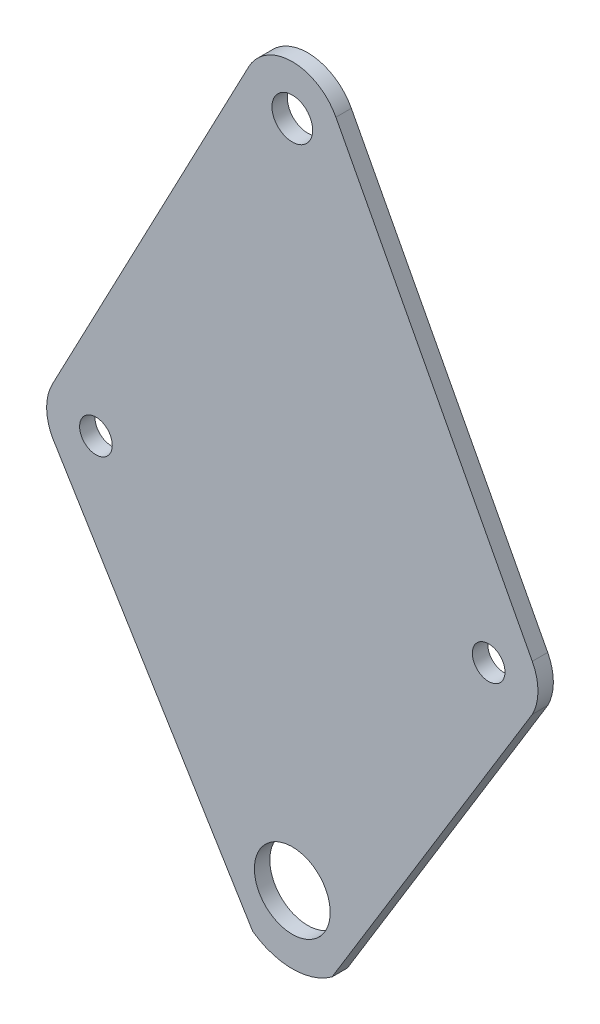
ISO-10303-21;
HEADER;
FILE_DESCRIPTION(('STEP AP214'),'2;1');
FILE_NAME('part.step','',(''),(''),'','','');
FILE_SCHEMA(('AUTOMOTIVE_DESIGN { 1 0 10303 214 1 1 1 1 }'));
ENDSEC;
DATA;
#1=APPLICATION_CONTEXT('core data for automotive mechanical design processes');
#2=APPLICATION_PROTOCOL_DEFINITION('international standard','automotive_design',2000,#1);
#3=PRODUCT_CONTEXT('',#1,'mechanical');
#4=PRODUCT('Part','Part','',(#3));
#5=PRODUCT_RELATED_PRODUCT_CATEGORY('part','',(#4));
#6=PRODUCT_DEFINITION_FORMATION('','',#4);
#7=PRODUCT_DEFINITION_CONTEXT('part definition',#1,'design');
#8=PRODUCT_DEFINITION('design','',#6,#7);
#9=PRODUCT_DEFINITION_SHAPE('','',#8);
#10=(LENGTH_UNIT() NAMED_UNIT(*) SI_UNIT(.MILLI.,.METRE.));
#11=(NAMED_UNIT(*) PLANE_ANGLE_UNIT() SI_UNIT($,.RADIAN.));
#12=(NAMED_UNIT(*) SI_UNIT($,.STERADIAN.) SOLID_ANGLE_UNIT());
#13=UNCERTAINTY_MEASURE_WITH_UNIT(LENGTH_MEASURE(1.E-05),#10,'distance_accuracy_value','');
#14=(GEOMETRIC_REPRESENTATION_CONTEXT(3) GLOBAL_UNCERTAINTY_ASSIGNED_CONTEXT((#13)) GLOBAL_UNIT_ASSIGNED_CONTEXT((#10,
#11,#12)) REPRESENTATION_CONTEXT('',''));
#15=CARTESIAN_POINT('',(0.,0.,0.));
#16=DIRECTION('',(0.,0.,1.));
#17=DIRECTION('',(1.,0.,0.));
#18=AXIS2_PLACEMENT_3D('',#15,#16,#17);
#19=CARTESIAN_POINT('',(10.9931399475967,-6.72221027351854,3.175));
#20=DIRECTION('',(-0.853137453063207,0.521686195121957,0.));
#21=DIRECTION('',(-0.521686195121957,-0.853137453063207,0.));
#22=AXIS2_PLACEMENT_3D('',#19,#20,#21);
#23=PLANE('',#22);
#24=DIRECTION('',(0.521686195121957,0.853137453063207,0.));
#25=VECTOR('',#24,1.);
#26=CARTESIAN_POINT('',(10.9931399475967,-6.72221027351854,0.));
#27=LINE('',#26,#25);
#28=CARTESIAN_POINT('',(8.17779026727476,-11.3262812230876,0.));
#29=VERTEX_POINT('',#28);
#30=CARTESIAN_POINT('',(49.4532460993312,56.1733720011107,0.));
#31=VERTEX_POINT('',#30);
#32=EDGE_CURVE('E162',#29,#31,#27,.T.);
#33=ORIENTED_EDGE('',*,*,#32,.T.);
#34=DIRECTION('',(0.,0.,-1.));
#35=VECTOR('',#34,1.);
#36=CARTESIAN_POINT('',(49.4532460993312,56.1733720011107,3.175));
#37=LINE('',#36,#35);
#38=CARTESIAN_POINT('',(49.4532460993312,56.1733720011107,3.175));
#39=VERTEX_POINT('',#38);
#40=EDGE_CURVE('E11',#39,#31,#37,.T.);
#41=ORIENTED_EDGE('',*,*,#40,.F.);
#42=DIRECTION('',(0.521686195121957,0.853137453063207,0.));
#43=VECTOR('',#42,1.);
#44=CARTESIAN_POINT('',(10.9931399475967,-6.72221027351854,3.175));
#45=LINE('',#44,#43);
#46=CARTESIAN_POINT('',(8.17779026727476,-11.3262812230876,3.175));
#47=VERTEX_POINT('',#46);
#48=EDGE_CURVE('E204',#47,#39,#45,.T.);
#49=ORIENTED_EDGE('',*,*,#48,.F.);
#50=DIRECTION('',(0.,0.,-1.));
#51=VECTOR('',#50,1.);
#52=CARTESIAN_POINT('',(8.17779026727476,-11.3262812230876,3.175));
#53=LINE('',#52,#51);
#54=EDGE_CURVE('E161',#47,#29,#53,.T.);
#55=ORIENTED_EDGE('',*,*,#54,.T.);
#56=EDGE_LOOP('',(#33,#41,#49,#55));
#57=FACE_BOUND('',#56,.T.);
#58=ADVANCED_FACE('F45',(#57),#23,.F.);
#59=CARTESIAN_POINT('',(40.4627403985417,60.9058562582501,3.175));
#60=DIRECTION('',(0.,0.,-1.));
#61=DIRECTION('',(-1.,0.,0.));
#62=AXIS2_PLACEMENT_3D('',#59,#60,#61);
#63=CYLINDRICAL_SURFACE('',#62,10.16);
#64=CARTESIAN_POINT('',(40.4627403985417,60.9058562582501,0.));
#65=DIRECTION('',(0.,0.,1.));
#66=DIRECTION('',(1.,0.,0.));
#67=AXIS2_PLACEMENT_3D('',#64,#65,#66);
#68=CIRCLE('',#67,10.16);
#69=CARTESIAN_POINT('',(49.4532460993312,65.6383405153894,0.));
#70=VERTEX_POINT('',#69);
#71=EDGE_CURVE('E166',#31,#70,#68,.T.);
#72=ORIENTED_EDGE('',*,*,#71,.T.);
#73=DIRECTION('',(0.,0.,-1.));
#74=VECTOR('',#73,1.);
#75=CARTESIAN_POINT('',(49.4532460993312,65.6383405153894,3.175));
#76=LINE('',#75,#74);
#77=CARTESIAN_POINT('',(49.4532460993312,65.6383405153894,3.175));
#78=VERTEX_POINT('',#77);
#79=EDGE_CURVE('E54',#78,#70,#76,.T.);
#80=ORIENTED_EDGE('',*,*,#79,.F.);
#81=CARTESIAN_POINT('',(40.4627403985417,60.9058562582501,3.175));
#82=DIRECTION('',(0.,0.,1.));
#83=DIRECTION('',(1.,0.,0.));
#84=AXIS2_PLACEMENT_3D('',#81,#82,#83);
#85=CIRCLE('',#84,10.16);
#86=EDGE_CURVE('E101',#39,#78,#85,.T.);
#87=ORIENTED_EDGE('',*,*,#86,.F.);
#88=ORIENTED_EDGE('',*,*,#40,.T.);
#89=EDGE_LOOP('',(#72,#80,#87,#88));
#90=FACE_BOUND('',#89,.T.);
#91=ADVANCED_FACE('F246',(#90),#63,.T.);
#92=CARTESIAN_POINT('',(65.7783383451268,34.6248543785212,3.175));
#93=DIRECTION('',(-0.88489229338479,-0.465795694600333,0.));
#94=DIRECTION('',(0.465795694600333,-0.88489229338479,0.));
#95=AXIS2_PLACEMENT_3D('',#92,#93,#94);
#96=PLANE('',#95);
#97=DIRECTION('',(-0.465795694600333,0.88489229338479,0.));
#98=VECTOR('',#97,1.);
#99=CARTESIAN_POINT('',(65.7783383451268,34.6248543785212,0.));
#100=LINE('',#99,#98);
#101=CARTESIAN_POINT('',(8.99050570078949,142.507164257139,0.));
#102=VERTEX_POINT('',#101);
#103=EDGE_CURVE('E169',#70,#102,#100,.T.);
#104=ORIENTED_EDGE('',*,*,#103,.T.);
#105=DIRECTION('',(0.,0.,-1.));
#106=VECTOR('',#105,1.);
#107=CARTESIAN_POINT('',(8.99050570078949,142.507164257139,3.175));
#108=LINE('',#107,#106);
#109=CARTESIAN_POINT('',(8.99050570078949,142.507164257139,3.175));
#110=VERTEX_POINT('',#109);
#111=EDGE_CURVE('E214',#110,#102,#108,.T.);
#112=ORIENTED_EDGE('',*,*,#111,.F.);
#113=DIRECTION('',(-0.465795694600333,0.88489229338479,0.));
#114=VECTOR('',#113,1.);
#115=CARTESIAN_POINT('',(65.7783383451268,34.6248543785212,3.175));
#116=LINE('',#115,#114);
#117=EDGE_CURVE('E223',#78,#110,#116,.T.);
#118=ORIENTED_EDGE('',*,*,#117,.F.);
#119=ORIENTED_EDGE('',*,*,#79,.T.);
#120=EDGE_LOOP('',(#104,#112,#118,#119));
#121=FACE_BOUND('',#120,.T.);
#122=ADVANCED_FACE('F221',(#121),#96,.F.);
#123=CARTESIAN_POINT('',(0.,137.77468,3.175));
#124=DIRECTION('',(0.,0.,-1.));
#125=DIRECTION('',(-1.,0.,0.));
#126=AXIS2_PLACEMENT_3D('',#123,#124,#125);
#127=CYLINDRICAL_SURFACE('',#126,10.16);
#128=CARTESIAN_POINT('',(0.,137.77468,0.));
#129=DIRECTION('',(0.,0.,1.));
#130=DIRECTION('',(1.,0.,0.));
#131=AXIS2_PLACEMENT_3D('',#128,#129,#130);
#132=CIRCLE('',#131,10.16);
#133=CARTESIAN_POINT('',(-8.99050570078951,142.507164257139,0.));
#134=VERTEX_POINT('',#133);
#135=EDGE_CURVE('E173',#134,#102,#132,.F.);
#136=ORIENTED_EDGE('',*,*,#135,.F.);
#137=DIRECTION('',(0.,0.,-1.));
#138=VECTOR('',#137,1.);
#139=CARTESIAN_POINT('',(-8.99050570078951,142.507164257139,3.175));
#140=LINE('',#139,#138);
#141=CARTESIAN_POINT('',(-8.99050570078951,142.507164257139,3.175));
#142=VERTEX_POINT('',#141);
#143=EDGE_CURVE('E211',#142,#134,#140,.T.);
#144=ORIENTED_EDGE('',*,*,#143,.F.);
#145=CARTESIAN_POINT('',(0.,137.77468,3.175));
#146=DIRECTION('',(0.,0.,1.));
#147=DIRECTION('',(1.,0.,0.));
#148=AXIS2_PLACEMENT_3D('',#145,#146,#147);
#149=CIRCLE('',#148,10.16);
#150=EDGE_CURVE('E233',#142,#110,#149,.F.);
#151=ORIENTED_EDGE('',*,*,#150,.T.);
#152=ORIENTED_EDGE('',*,*,#111,.T.);
#153=EDGE_LOOP('',(#136,#144,#151,#152));
#154=FACE_BOUND('',#153,.T.);
#155=ADVANCED_FACE('F231',(#154),#127,.T.);
#156=CARTESIAN_POINT('',(-65.7783383451263,34.6248543785204,3.175));
#157=DIRECTION('',(-0.884892293384793,0.465795694600327,0.));
#158=DIRECTION('',(-0.465795694600327,-0.884892293384793,0.));
#159=AXIS2_PLACEMENT_3D('',#156,#157,#158);
#160=PLANE('',#159);
#161=DIRECTION('',(0.465795694600327,0.884892293384793,0.));
#162=VECTOR('',#161,1.);
#163=CARTESIAN_POINT('',(-65.7783383451263,34.6248543785204,0.));
#164=LINE('',#163,#162);
#165=CARTESIAN_POINT('',(-49.4532460993307,65.6383405153891,0.));
#166=VERTEX_POINT('',#165);
#167=EDGE_CURVE('E177',#166,#134,#164,.T.);
#168=ORIENTED_EDGE('',*,*,#167,.F.);
#169=DIRECTION('',(0.,0.,-1.));
#170=VECTOR('',#169,1.);
#171=CARTESIAN_POINT('',(-49.4532460993307,65.6383405153891,3.175));
#172=LINE('',#171,#170);
#173=CARTESIAN_POINT('',(-49.4532460993307,65.6383405153891,3.175));
#174=VERTEX_POINT('',#173);
#175=EDGE_CURVE('E127',#174,#166,#172,.T.);
#176=ORIENTED_EDGE('',*,*,#175,.F.);
#177=DIRECTION('',(0.465795694600327,0.884892293384793,0.));
#178=VECTOR('',#177,1.);
#179=CARTESIAN_POINT('',(-65.7783383451263,34.6248543785204,3.175));
#180=LINE('',#179,#178);
#181=EDGE_CURVE('E135',#174,#142,#180,.T.);
#182=ORIENTED_EDGE('',*,*,#181,.T.);
#183=ORIENTED_EDGE('',*,*,#143,.T.);
#184=EDGE_LOOP('',(#168,#176,#182,#183));
#185=FACE_BOUND('',#184,.T.);
#186=ADVANCED_FACE('F256',(#185),#160,.T.);
#187=CARTESIAN_POINT('',(-40.4627403985412,60.9058562582498,3.175));
#188=DIRECTION('',(0.,0.,-1.));
#189=DIRECTION('',(-1.,0.,0.));
#190=AXIS2_PLACEMENT_3D('',#187,#188,#189);
#191=CYLINDRICAL_SURFACE('',#190,10.16);
#192=CARTESIAN_POINT('',(-40.4627403985412,60.9058562582498,0.));
#193=DIRECTION('',(0.,0.,1.));
#194=DIRECTION('',(1.,0.,0.));
#195=AXIS2_PLACEMENT_3D('',#192,#193,#194);
#196=CIRCLE('',#195,10.16);
#197=CARTESIAN_POINT('',(-49.4532460993306,56.1733720011104,0.));
#198=VERTEX_POINT('',#197);
#199=EDGE_CURVE('E121',#198,#166,#196,.F.);
#200=ORIENTED_EDGE('',*,*,#199,.F.);
#201=DIRECTION('',(0.,0.,-1.));
#202=VECTOR('',#201,1.);
#203=CARTESIAN_POINT('',(-49.4532460993306,56.1733720011104,3.175));
#204=LINE('',#203,#202);
#205=CARTESIAN_POINT('',(-49.4532460993306,56.1733720011104,3.175));
#206=VERTEX_POINT('',#205);
#207=EDGE_CURVE('E116',#206,#198,#204,.T.);
#208=ORIENTED_EDGE('',*,*,#207,.F.);
#209=CARTESIAN_POINT('',(-40.4627403985412,60.9058562582498,3.175));
#210=DIRECTION('',(0.,0.,1.));
#211=DIRECTION('',(1.,0.,0.));
#212=AXIS2_PLACEMENT_3D('',#209,#210,#211);
#213=CIRCLE('',#212,10.16);
#214=EDGE_CURVE('E119',#206,#174,#213,.F.);
#215=ORIENTED_EDGE('',*,*,#214,.T.);
#216=ORIENTED_EDGE('',*,*,#175,.T.);
#217=EDGE_LOOP('',(#200,#208,#215,#216));
#218=FACE_BOUND('',#217,.T.);
#219=ADVANCED_FACE('F118',(#218),#191,.T.);
#220=CARTESIAN_POINT('',(-10.993139947596,-6.7222102735182,3.175));
#221=DIRECTION('',(-0.853137453063203,-0.521686195121963,0.));
#222=DIRECTION('',(0.521686195121963,-0.853137453063203,0.));
#223=AXIS2_PLACEMENT_3D('',#220,#221,#222);
#224=PLANE('',#223);
#225=DIRECTION('',(-0.521686195121963,0.853137453063203,0.));
#226=VECTOR('',#225,1.);
#227=CARTESIAN_POINT('',(-10.993139947596,-6.7222102735182,0.));
#228=LINE('',#227,#226);
#229=CARTESIAN_POINT('',(-8.17779026727374,-11.3262812230876,0.));
#230=VERTEX_POINT('',#229);
#231=EDGE_CURVE('E183',#230,#198,#228,.T.);
#232=ORIENTED_EDGE('',*,*,#231,.F.);
#233=DIRECTION('',(0.,0.,-1.));
#234=VECTOR('',#233,1.);
#235=CARTESIAN_POINT('',(-8.17779026727374,-11.3262812230876,3.175));
#236=LINE('',#235,#234);
#237=CARTESIAN_POINT('',(-8.17779026727374,-11.3262812230876,3.175));
#238=VERTEX_POINT('',#237);
#239=EDGE_CURVE('E90',#238,#230,#236,.T.);
#240=ORIENTED_EDGE('',*,*,#239,.F.);
#241=DIRECTION('',(-0.521686195121963,0.853137453063203,0.));
#242=VECTOR('',#241,1.);
#243=CARTESIAN_POINT('',(-10.993139947596,-6.7222102735182,3.175));
#244=LINE('',#243,#242);
#245=EDGE_CURVE('E132',#238,#206,#244,.T.);
#246=ORIENTED_EDGE('',*,*,#245,.T.);
#247=ORIENTED_EDGE('',*,*,#207,.T.);
#248=EDGE_LOOP('',(#232,#240,#246,#247));
#249=FACE_BOUND('',#248,.T.);
#250=ADVANCED_FACE('F138',(#249),#224,.T.);
#251=CARTESIAN_POINT('',(0.,0.,3.175));
#252=DIRECTION('',(0.,0.,-1.));
#253=DIRECTION('',(-1.,0.,0.));
#254=AXIS2_PLACEMENT_3D('',#251,#252,#253);
#255=CYLINDRICAL_SURFACE('',#254,7.8105);
#256=CARTESIAN_POINT('',(0.,0.,3.175));
#257=DIRECTION('',(0.,0.,1.));
#258=DIRECTION('',(1.,0.,0.));
#259=AXIS2_PLACEMENT_3D('',#256,#257,#258);
#260=CIRCLE('',#259,7.8105);
#261=CARTESIAN_POINT('',(7.8105,0.,3.175));
#262=VERTEX_POINT('',#261);
#263=EDGE_CURVE('E153',#262,#262,#260,.T.);
#264=ORIENTED_EDGE('',*,*,#263,.T.);
#265=EDGE_LOOP('',(#264));
#266=FACE_BOUND('',#265,.T.);
#267=CARTESIAN_POINT('',(0.,0.,0.));
#268=DIRECTION('',(0.,0.,1.));
#269=DIRECTION('',(1.,0.,0.));
#270=AXIS2_PLACEMENT_3D('',#267,#268,#269);
#271=CIRCLE('',#270,7.8105);
#272=CARTESIAN_POINT('',(7.8105,0.,0.));
#273=VERTEX_POINT('',#272);
#274=EDGE_CURVE('E196',#273,#273,#271,.T.);
#275=ORIENTED_EDGE('',*,*,#274,.F.);
#276=EDGE_LOOP('',(#275));
#277=FACE_BOUND('',#276,.T.);
#278=ADVANCED_FACE('F264',(#266,#277),#255,.F.);
#279=CARTESIAN_POINT('',(0.,137.77468,3.175));
#280=DIRECTION('',(0.,0.,-1.));
#281=DIRECTION('',(-1.,0.,0.));
#282=AXIS2_PLACEMENT_3D('',#279,#280,#281);
#283=CYLINDRICAL_SURFACE('',#282,4.191);
#284=CARTESIAN_POINT('',(0.,137.77468,3.175));
#285=DIRECTION('',(0.,0.,1.));
#286=DIRECTION('',(1.,0.,0.));
#287=AXIS2_PLACEMENT_3D('',#284,#285,#286);
#288=CIRCLE('',#287,4.191);
#289=CARTESIAN_POINT('',(4.191,137.77468,3.175));
#290=VERTEX_POINT('',#289);
#291=EDGE_CURVE('E149',#290,#290,#288,.T.);
#292=ORIENTED_EDGE('',*,*,#291,.T.);
#293=EDGE_LOOP('',(#292));
#294=FACE_BOUND('',#293,.T.);
#295=CARTESIAN_POINT('',(0.,137.77468,0.));
#296=DIRECTION('',(0.,0.,1.));
#297=DIRECTION('',(1.,0.,0.));
#298=AXIS2_PLACEMENT_3D('',#295,#296,#297);
#299=CIRCLE('',#298,4.191);
#300=CARTESIAN_POINT('',(4.191,137.77468,0.));
#301=VERTEX_POINT('',#300);
#302=EDGE_CURVE('E192',#301,#301,#299,.T.);
#303=ORIENTED_EDGE('',*,*,#302,.F.);
#304=EDGE_LOOP('',(#303));
#305=FACE_BOUND('',#304,.T.);
#306=ADVANCED_FACE('F272',(#294,#305),#283,.F.);
#307=CARTESIAN_POINT('',(-40.4627403985412,60.9058562582498,3.175));
#308=DIRECTION('',(0.,0.,-1.));
#309=DIRECTION('',(-1.,0.,0.));
#310=AXIS2_PLACEMENT_3D('',#307,#308,#309);
#311=CYLINDRICAL_SURFACE('',#310,3.36549999999999);
#312=CARTESIAN_POINT('',(-40.4627403985412,60.9058562582498,3.175));
#313=DIRECTION('',(0.,0.,1.));
#314=DIRECTION('',(1.,0.,0.));
#315=AXIS2_PLACEMENT_3D('',#312,#313,#314);
#316=CIRCLE('',#315,3.36549999999999);
#317=CARTESIAN_POINT('',(-37.0972403985412,60.9058562582498,3.175));
#318=VERTEX_POINT('',#317);
#319=EDGE_CURVE('E142',#318,#318,#316,.F.);
#320=ORIENTED_EDGE('',*,*,#319,.F.);
#321=EDGE_LOOP('',(#320));
#322=FACE_BOUND('',#321,.T.);
#323=CARTESIAN_POINT('',(-40.4627403985412,60.9058562582498,0.));
#324=DIRECTION('',(0.,0.,1.));
#325=DIRECTION('',(1.,0.,0.));
#326=AXIS2_PLACEMENT_3D('',#323,#324,#325);
#327=CIRCLE('',#326,3.36549999999999);
#328=CARTESIAN_POINT('',(-37.0972403985412,60.9058562582498,0.));
#329=VERTEX_POINT('',#328);
#330=EDGE_CURVE('E188',#329,#329,#327,.F.);
#331=ORIENTED_EDGE('',*,*,#330,.T.);
#332=EDGE_LOOP('',(#331));
#333=FACE_BOUND('',#332,.T.);
#334=ADVANCED_FACE('F269',(#322,#333),#311,.F.);
#335=CARTESIAN_POINT('',(0.,0.,3.175));
#336=DIRECTION('',(0.,0.,-1.));
#337=DIRECTION('',(-1.,0.,0.));
#338=AXIS2_PLACEMENT_3D('',#335,#336,#337);
#339=CYLINDRICAL_SURFACE('',#338,13.97);
#340=CARTESIAN_POINT('',(0.,0.,0.));
#341=DIRECTION('',(0.,0.,1.));
#342=DIRECTION('',(1.,0.,0.));
#343=AXIS2_PLACEMENT_3D('',#340,#341,#342);
#344=CIRCLE('',#343,13.97);
#345=EDGE_CURVE('E93',#230,#29,#344,.T.);
#346=ORIENTED_EDGE('',*,*,#345,.T.);
#347=ORIENTED_EDGE('',*,*,#54,.F.);
#348=CARTESIAN_POINT('',(0.,0.,3.175));
#349=DIRECTION('',(0.,0.,1.));
#350=DIRECTION('',(1.,0.,0.));
#351=AXIS2_PLACEMENT_3D('',#348,#349,#350);
#352=CIRCLE('',#351,13.97);
#353=EDGE_CURVE('E62',#238,#47,#352,.T.);
#354=ORIENTED_EDGE('',*,*,#353,.F.);
#355=ORIENTED_EDGE('',*,*,#239,.T.);
#356=EDGE_LOOP('',(#346,#347,#354,#355));
#357=FACE_BOUND('',#356,.T.);
#358=ADVANCED_FACE('F265',(#357),#339,.T.);
#359=CARTESIAN_POINT('',(40.4627403985417,60.9058562582501,3.175));
#360=DIRECTION('',(0.,0.,-1.));
#361=DIRECTION('',(-1.,0.,0.));
#362=AXIS2_PLACEMENT_3D('',#359,#360,#361);
#363=CYLINDRICAL_SURFACE('',#362,3.3655);
#364=CARTESIAN_POINT('',(40.4627403985417,60.9058562582501,3.175));
#365=DIRECTION('',(0.,0.,1.));
#366=DIRECTION('',(1.,0.,0.));
#367=AXIS2_PLACEMENT_3D('',#364,#365,#366);
#368=CIRCLE('',#367,3.3655);
#369=CARTESIAN_POINT('',(43.8282403985417,60.9058562582501,3.175));
#370=VERTEX_POINT('',#369);
#371=EDGE_CURVE('E157',#370,#370,#368,.T.);
#372=ORIENTED_EDGE('',*,*,#371,.T.);
#373=EDGE_LOOP('',(#372));
#374=FACE_BOUND('',#373,.T.);
#375=CARTESIAN_POINT('',(40.4627403985417,60.9058562582501,0.));
#376=DIRECTION('',(0.,0.,1.));
#377=DIRECTION('',(1.,0.,0.));
#378=AXIS2_PLACEMENT_3D('',#375,#376,#377);
#379=CIRCLE('',#378,3.3655);
#380=CARTESIAN_POINT('',(43.8282403985417,60.9058562582501,0.));
#381=VERTEX_POINT('',#380);
#382=EDGE_CURVE('E200',#381,#381,#379,.T.);
#383=ORIENTED_EDGE('',*,*,#382,.F.);
#384=EDGE_LOOP('',(#383));
#385=FACE_BOUND('',#384,.T.);
#386=ADVANCED_FACE('F268',(#374,#385),#363,.F.);
#387=CARTESIAN_POINT('',(0.,0.,3.175));
#388=DIRECTION('',(0.,0.,1.));
#389=DIRECTION('',(1.,0.,0.));
#390=AXIS2_PLACEMENT_3D('',#387,#388,#389);
#391=PLANE('',#390);
#392=ORIENTED_EDGE('',*,*,#48,.T.);
#393=ORIENTED_EDGE('',*,*,#86,.T.);
#394=ORIENTED_EDGE('',*,*,#117,.T.);
#395=ORIENTED_EDGE('',*,*,#150,.F.);
#396=ORIENTED_EDGE('',*,*,#181,.F.);
#397=ORIENTED_EDGE('',*,*,#214,.F.);
#398=ORIENTED_EDGE('',*,*,#245,.F.);
#399=ORIENTED_EDGE('',*,*,#353,.T.);
#400=EDGE_LOOP('',(#392,#393,#394,#395,#396,#397,#398,#399));
#401=FACE_BOUND('',#400,.T.);
#402=ORIENTED_EDGE('',*,*,#319,.T.);
#403=EDGE_LOOP('',(#402));
#404=FACE_BOUND('',#403,.T.);
#405=ORIENTED_EDGE('',*,*,#291,.F.);
#406=EDGE_LOOP('',(#405));
#407=FACE_BOUND('',#406,.T.);
#408=ORIENTED_EDGE('',*,*,#263,.F.);
#409=EDGE_LOOP('',(#408));
#410=FACE_BOUND('',#409,.T.);
#411=ORIENTED_EDGE('',*,*,#371,.F.);
#412=EDGE_LOOP('',(#411));
#413=FACE_BOUND('',#412,.T.);
#414=ADVANCED_FACE('F130',(#401,#404,#407,#410,#413),#391,.T.);
#415=CARTESIAN_POINT('',(0.,0.,0.));
#416=DIRECTION('',(0.,0.,1.));
#417=DIRECTION('',(1.,0.,0.));
#418=AXIS2_PLACEMENT_3D('',#415,#416,#417);
#419=PLANE('',#418);
#420=ORIENTED_EDGE('',*,*,#32,.F.);
#421=ORIENTED_EDGE('',*,*,#345,.F.);
#422=ORIENTED_EDGE('',*,*,#231,.T.);
#423=ORIENTED_EDGE('',*,*,#199,.T.);
#424=ORIENTED_EDGE('',*,*,#167,.T.);
#425=ORIENTED_EDGE('',*,*,#135,.T.);
#426=ORIENTED_EDGE('',*,*,#103,.F.);
#427=ORIENTED_EDGE('',*,*,#71,.F.);
#428=EDGE_LOOP('',(#420,#421,#422,#423,#424,#425,#426,#427));
#429=FACE_BOUND('',#428,.T.);
#430=ORIENTED_EDGE('',*,*,#330,.F.);
#431=EDGE_LOOP('',(#430));
#432=FACE_BOUND('',#431,.T.);
#433=ORIENTED_EDGE('',*,*,#302,.T.);
#434=EDGE_LOOP('',(#433));
#435=FACE_BOUND('',#434,.T.);
#436=ORIENTED_EDGE('',*,*,#274,.T.);
#437=EDGE_LOOP('',(#436));
#438=FACE_BOUND('',#437,.T.);
#439=ORIENTED_EDGE('',*,*,#382,.T.);
#440=EDGE_LOOP('',(#439));
#441=FACE_BOUND('',#440,.T.);
#442=ADVANCED_FACE('F226',(#429,#432,#435,#438,#441),#419,.F.);
#443=CLOSED_SHELL('',(#58,#91,#122,#155,#186,#219,#250,#278,#306,#334,#358,#386,#414,#442));
#444=MANIFOLD_SOLID_BREP('B2',#443);
#445=ADVANCED_BREP_SHAPE_REPRESENTATION('',(#18,#444),#14);
#446=SHAPE_DEFINITION_REPRESENTATION(#9,#445);
ENDSEC;
END-ISO-10303-21;
